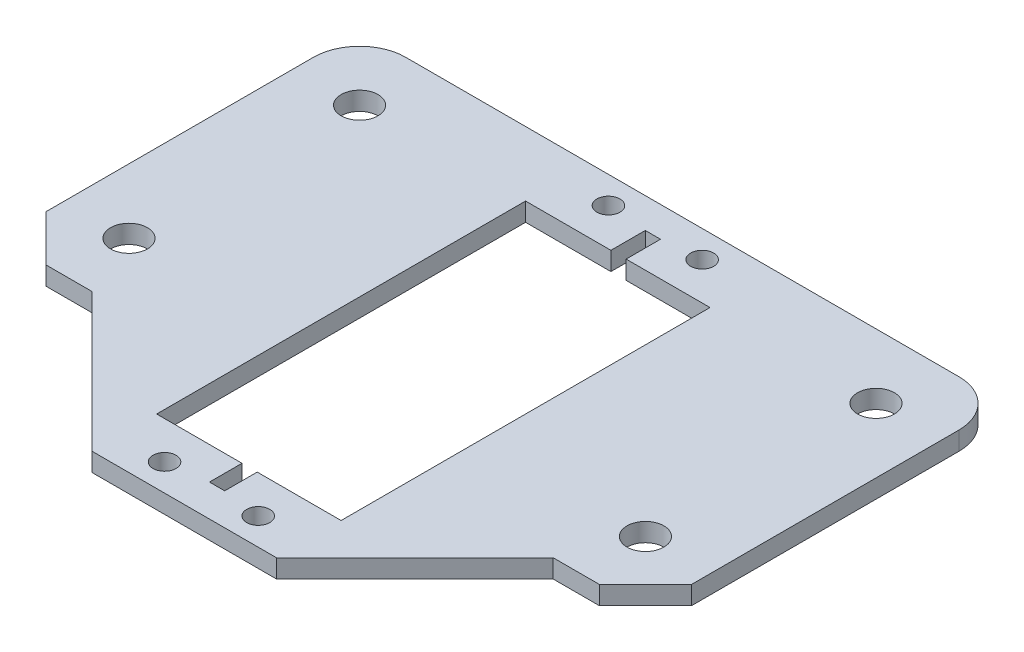
ISO-10303-21;
HEADER;
FILE_DESCRIPTION(('STEP AP214'),'2;1');
FILE_NAME('part.step','',(''),(''),'','','');
FILE_SCHEMA(('AUTOMOTIVE_DESIGN { 1 0 10303 214 1 1 1 1 }'));
ENDSEC;
DATA;
#1=APPLICATION_CONTEXT('core data for automotive mechanical design processes');
#2=APPLICATION_PROTOCOL_DEFINITION('international standard','automotive_design',2000,#1);
#3=PRODUCT_CONTEXT('',#1,'mechanical');
#4=PRODUCT('Part','Part','',(#3));
#5=PRODUCT_RELATED_PRODUCT_CATEGORY('part','',(#4));
#6=PRODUCT_DEFINITION_FORMATION('','',#4);
#7=PRODUCT_DEFINITION_CONTEXT('part definition',#1,'design');
#8=PRODUCT_DEFINITION('design','',#6,#7);
#9=PRODUCT_DEFINITION_SHAPE('','',#8);
#10=(LENGTH_UNIT() NAMED_UNIT(*) SI_UNIT(.MILLI.,.METRE.));
#11=(NAMED_UNIT(*) PLANE_ANGLE_UNIT() SI_UNIT($,.RADIAN.));
#12=(NAMED_UNIT(*) SI_UNIT($,.STERADIAN.) SOLID_ANGLE_UNIT());
#13=UNCERTAINTY_MEASURE_WITH_UNIT(LENGTH_MEASURE(1.E-05),#10,'distance_accuracy_value','');
#14=(GEOMETRIC_REPRESENTATION_CONTEXT(3) GLOBAL_UNCERTAINTY_ASSIGNED_CONTEXT((#13)) GLOBAL_UNIT_ASSIGNED_CONTEXT((#10,
#11,#12)) REPRESENTATION_CONTEXT('',''));
#15=CARTESIAN_POINT('',(0.,0.,0.));
#16=DIRECTION('',(0.,0.,1.));
#17=DIRECTION('',(1.,0.,0.));
#18=AXIS2_PLACEMENT_3D('',#15,#16,#17);
#19=CARTESIAN_POINT('',(-15.8393117352359,2.,13.3286413196333));
#20=DIRECTION('',(0.,0.,1.));
#21=DIRECTION('',(1.,0.,0.));
#22=AXIS2_PLACEMENT_3D('',#19,#20,#21);
#23=PLANE('',#22);
#24=DIRECTION('',(0.,1.,0.));
#25=VECTOR('',#24,1.);
#26=CARTESIAN_POINT('',(-4.93621326802125,2.,13.3286413196333));
#27=LINE('',#26,#25);
#28=CARTESIAN_POINT('',(-4.93621326802125,0.,13.3286413196333));
#29=VERTEX_POINT('',#28);
#30=CARTESIAN_POINT('',(-4.93621326802125,2.,13.3286413196333));
#31=VERTEX_POINT('',#30);
#32=EDGE_CURVE('E207',#29,#31,#27,.T.);
#33=ORIENTED_EDGE('',*,*,#32,.F.);
#34=DIRECTION('',(-1.,0.,0.));
#35=VECTOR('',#34,1.);
#36=CARTESIAN_POINT('',(-15.8393117352359,0.,13.3286413196333));
#37=LINE('',#36,#35);
#38=CARTESIAN_POINT('',(4.16068826476406,0.,13.3286413196333));
#39=VERTEX_POINT('',#38);
#40=EDGE_CURVE('E224',#39,#29,#37,.T.);
#41=ORIENTED_EDGE('',*,*,#40,.F.);
#42=DIRECTION('',(0.,-1.,0.));
#43=VECTOR('',#42,1.);
#44=CARTESIAN_POINT('',(4.16068826476406,2.,13.3286413196333));
#45=LINE('',#44,#43);
#46=CARTESIAN_POINT('',(4.16068826476406,2.,13.3286413196333));
#47=VERTEX_POINT('',#46);
#48=EDGE_CURVE('E234',#47,#39,#45,.T.);
#49=ORIENTED_EDGE('',*,*,#48,.F.);
#50=DIRECTION('',(-1.,0.,0.));
#51=VECTOR('',#50,1.);
#52=CARTESIAN_POINT('',(-15.8393117352359,2.,13.3286413196333));
#53=LINE('',#52,#51);
#54=EDGE_CURVE('E235',#47,#31,#53,.T.);
#55=ORIENTED_EDGE('',*,*,#54,.T.);
#56=EDGE_LOOP('',(#33,#41,#49,#55));
#57=FACE_BOUND('',#56,.T.);
#58=ADVANCED_FACE('F33',(#57),#23,.T.);
#59=CARTESIAN_POINT('',(-15.8393117352359,2.,53.3286413196333));
#60=DIRECTION('',(0.,0.,-1.));
#61=DIRECTION('',(-1.,0.,0.));
#62=AXIS2_PLACEMENT_3D('',#59,#60,#61);
#63=PLANE('',#62);
#64=DIRECTION('',(0.,1.,0.));
#65=VECTOR('',#64,1.);
#66=CARTESIAN_POINT('',(-6.58654078677002,2.,53.3286413196333));
#67=LINE('',#66,#65);
#68=CARTESIAN_POINT('',(-6.58654078677002,0.,53.3286413196333));
#69=VERTEX_POINT('',#68);
#70=CARTESIAN_POINT('',(-6.58654078677002,2.,53.3286413196333));
#71=VERTEX_POINT('',#70);
#72=EDGE_CURVE('E208',#69,#71,#67,.T.);
#73=ORIENTED_EDGE('',*,*,#72,.F.);
#74=DIRECTION('',(1.,0.,0.));
#75=VECTOR('',#74,1.);
#76=CARTESIAN_POINT('',(-15.8393117352359,0.,53.3286413196333));
#77=LINE('',#76,#75);
#78=CARTESIAN_POINT('',(-15.8393117352359,0.,53.3286413196333));
#79=VERTEX_POINT('',#78);
#80=EDGE_CURVE('E229',#79,#69,#77,.T.);
#81=ORIENTED_EDGE('',*,*,#80,.F.);
#82=DIRECTION('',(0.,-1.,0.));
#83=VECTOR('',#82,1.);
#84=CARTESIAN_POINT('',(-15.8393117352359,2.,53.3286413196333));
#85=LINE('',#84,#83);
#86=CARTESIAN_POINT('',(-15.8393117352359,2.,53.3286413196333));
#87=VERTEX_POINT('',#86);
#88=EDGE_CURVE('E240',#87,#79,#85,.T.);
#89=ORIENTED_EDGE('',*,*,#88,.F.);
#90=DIRECTION('',(1.,0.,0.));
#91=VECTOR('',#90,1.);
#92=CARTESIAN_POINT('',(-15.8393117352359,2.,53.3286413196333));
#93=LINE('',#92,#91);
#94=EDGE_CURVE('E389',#87,#71,#93,.T.);
#95=ORIENTED_EDGE('',*,*,#94,.T.);
#96=EDGE_LOOP('',(#73,#81,#89,#95));
#97=FACE_BOUND('',#96,.T.);
#98=ADVANCED_FACE('F499',(#97),#63,.T.);
#99=CARTESIAN_POINT('',(0.,2.,0.));
#100=DIRECTION('',(0.,1.,0.));
#101=DIRECTION('',(0.,0.,1.));
#102=AXIS2_PLACEMENT_3D('',#99,#100,#101);
#103=PLANE('',#102);
#104=DIRECTION('',(0.,0.,-1.));
#105=VECTOR('',#104,1.);
#106=CARTESIAN_POINT('',(-4.93621326802125,2.,0.));
#107=LINE('',#106,#105);
#108=CARTESIAN_POINT('',(-4.93621326802125,2.,9.60041775357783));
#109=VERTEX_POINT('',#108);
#110=EDGE_CURVE('E429',#31,#109,#107,.T.);
#111=ORIENTED_EDGE('',*,*,#110,.F.);
#112=ORIENTED_EDGE('',*,*,#54,.F.);
#113=DIRECTION('',(0.,0.,-1.));
#114=VECTOR('',#113,1.);
#115=CARTESIAN_POINT('',(4.16068826476406,2.,13.3286413196333));
#116=LINE('',#115,#114);
#117=CARTESIAN_POINT('',(4.16068826476407,2.,53.3286413196333));
#118=VERTEX_POINT('',#117);
#119=EDGE_CURVE('E392',#118,#47,#116,.T.);
#120=ORIENTED_EDGE('',*,*,#119,.F.);
#121=CARTESIAN_POINT('',(-4.93621326802125,2.,53.3286413196333));
#122=VERTEX_POINT('',#121);
#123=EDGE_CURVE('E388',#122,#118,#93,.T.);
#124=ORIENTED_EDGE('',*,*,#123,.F.);
#125=DIRECTION('',(0.,0.,-1.));
#126=VECTOR('',#125,1.);
#127=CARTESIAN_POINT('',(-4.93621326802125,2.,0.));
#128=LINE('',#127,#126);
#129=CARTESIAN_POINT('',(-4.93621326802125,2.,56.8558546423131));
#130=VERTEX_POINT('',#129);
#131=EDGE_CURVE('E442',#130,#122,#128,.T.);
#132=ORIENTED_EDGE('',*,*,#131,.F.);
#133=DIRECTION('',(1.,0.,0.));
#134=VECTOR('',#133,1.);
#135=CARTESIAN_POINT('',(0.,2.,56.8558546423131));
#136=LINE('',#135,#134);
#137=CARTESIAN_POINT('',(-6.58654078677002,2.,56.8558546423131));
#138=VERTEX_POINT('',#137);
#139=EDGE_CURVE('E447',#138,#130,#136,.T.);
#140=ORIENTED_EDGE('',*,*,#139,.F.);
#141=DIRECTION('',(0.,0.,1.));
#142=VECTOR('',#141,1.);
#143=CARTESIAN_POINT('',(-6.58654078677002,2.,0.));
#144=LINE('',#143,#142);
#145=EDGE_CURVE('E445',#71,#138,#144,.T.);
#146=ORIENTED_EDGE('',*,*,#145,.F.);
#147=ORIENTED_EDGE('',*,*,#94,.F.);
#148=DIRECTION('',(0.,0.,1.));
#149=VECTOR('',#148,1.);
#150=CARTESIAN_POINT('',(-15.8393117352359,2.,13.3286413196333));
#151=LINE('',#150,#149);
#152=CARTESIAN_POINT('',(-15.8393117352359,2.,13.3286413196333));
#153=VERTEX_POINT('',#152);
#154=EDGE_CURVE('E227',#153,#87,#151,.T.);
#155=ORIENTED_EDGE('',*,*,#154,.F.);
#156=CARTESIAN_POINT('',(-6.58654078677002,2.,13.3286413196333));
#157=VERTEX_POINT('',#156);
#158=EDGE_CURVE('E395',#157,#153,#53,.T.);
#159=ORIENTED_EDGE('',*,*,#158,.F.);
#160=DIRECTION('',(0.,0.,1.));
#161=VECTOR('',#160,1.);
#162=CARTESIAN_POINT('',(-6.58654078677002,2.,0.));
#163=LINE('',#162,#161);
#164=CARTESIAN_POINT('',(-6.58654078677002,2.,9.60041775357783));
#165=VERTEX_POINT('',#164);
#166=EDGE_CURVE('E203',#165,#157,#163,.T.);
#167=ORIENTED_EDGE('',*,*,#166,.F.);
#168=DIRECTION('',(-1.,0.,0.));
#169=VECTOR('',#168,1.);
#170=CARTESIAN_POINT('',(0.,2.,9.60041775357783));
#171=LINE('',#170,#169);
#172=EDGE_CURVE('E431',#109,#165,#171,.T.);
#173=ORIENTED_EDGE('',*,*,#172,.F.);
#174=EDGE_LOOP('',(#111,#112,#120,#124,#132,#140,#146,#147,#155,#159,#167,#173));
#175=FACE_BOUND('',#174,.T.);
#176=CARTESIAN_POINT('',(22.1606882647641,2.,13.3286413196333));
#177=DIRECTION('',(0.,1.,0.));
#178=DIRECTION('',(0.,0.,1.));
#179=AXIS2_PLACEMENT_3D('',#176,#177,#178);
#180=CIRCLE('',#179,2.);
#181=CARTESIAN_POINT('',(22.1606882647641,2.,15.3286413196333));
#182=VERTEX_POINT('',#181);
#183=EDGE_CURVE('E311',#182,#182,#180,.T.);
#184=ORIENTED_EDGE('',*,*,#183,.F.);
#185=EDGE_LOOP('',(#184));
#186=FACE_BOUND('',#185,.T.);
#187=CARTESIAN_POINT('',(-33.8393117352359,2.,13.3286413196333));
#188=DIRECTION('',(0.,1.,0.));
#189=DIRECTION('',(0.,0.,1.));
#190=AXIS2_PLACEMENT_3D('',#187,#188,#189);
#191=CIRCLE('',#190,2.);
#192=CARTESIAN_POINT('',(-33.8393117352359,2.,15.3286413196333));
#193=VERTEX_POINT('',#192);
#194=EDGE_CURVE('E307',#193,#193,#191,.T.);
#195=ORIENTED_EDGE('',*,*,#194,.F.);
#196=EDGE_LOOP('',(#195));
#197=FACE_BOUND('',#196,.T.);
#198=CARTESIAN_POINT('',(-33.8393117352359,2.,38.3286413196333));
#199=DIRECTION('',(0.,1.,0.));
#200=DIRECTION('',(0.,0.,1.));
#201=AXIS2_PLACEMENT_3D('',#198,#199,#200);
#202=CIRCLE('',#201,2.);
#203=CARTESIAN_POINT('',(-33.8393117352359,2.,40.3286413196333));
#204=VERTEX_POINT('',#203);
#205=EDGE_CURVE('E303',#204,#204,#202,.T.);
#206=ORIENTED_EDGE('',*,*,#205,.F.);
#207=EDGE_LOOP('',(#206));
#208=FACE_BOUND('',#207,.T.);
#209=CARTESIAN_POINT('',(22.1606882647641,2.,38.3286413196333));
#210=DIRECTION('',(0.,1.,0.));
#211=DIRECTION('',(0.,0.,1.));
#212=AXIS2_PLACEMENT_3D('',#209,#210,#211);
#213=CIRCLE('',#212,2.);
#214=CARTESIAN_POINT('',(22.1606882647641,2.,40.3286413196333));
#215=VERTEX_POINT('',#214);
#216=EDGE_CURVE('E299',#215,#215,#213,.T.);
#217=ORIENTED_EDGE('',*,*,#216,.F.);
#218=EDGE_LOOP('',(#217));
#219=FACE_BOUND('',#218,.T.);
#220=CARTESIAN_POINT('',(-0.759311735229143,2.,9.2621413196285));
#221=DIRECTION('',(0.,1.,0.));
#222=DIRECTION('',(0.,0.,1.));
#223=AXIS2_PLACEMENT_3D('',#220,#221,#222);
#224=CIRCLE('',#223,1.25);
#225=CARTESIAN_POINT('',(-0.759311735229143,2.,10.5121413196285));
#226=VERTEX_POINT('',#225);
#227=EDGE_CURVE('E362',#226,#226,#224,.T.);
#228=ORIENTED_EDGE('',*,*,#227,.F.);
#229=EDGE_LOOP('',(#228));
#230=FACE_BOUND('',#229,.T.);
#231=CARTESIAN_POINT('',(-10.9193117352291,2.,9.26214131962875));
#232=DIRECTION('',(0.,1.,0.));
#233=DIRECTION('',(0.,0.,1.));
#234=AXIS2_PLACEMENT_3D('',#231,#232,#233);
#235=CIRCLE('',#234,1.25);
#236=CARTESIAN_POINT('',(-10.9193117352291,2.,10.5121413196288));
#237=VERTEX_POINT('',#236);
#238=EDGE_CURVE('E366',#237,#237,#235,.T.);
#239=ORIENTED_EDGE('',*,*,#238,.F.);
#240=EDGE_LOOP('',(#239));
#241=FACE_BOUND('',#240,.T.);
#242=CARTESIAN_POINT('',(-0.759311735227947,2.,57.3951413196285));
#243=DIRECTION('',(0.,1.,0.));
#244=DIRECTION('',(0.,0.,1.));
#245=AXIS2_PLACEMENT_3D('',#242,#243,#244);
#246=CIRCLE('',#245,1.25);
#247=CARTESIAN_POINT('',(-0.759311735227947,2.,58.6451413196285));
#248=VERTEX_POINT('',#247);
#249=EDGE_CURVE('E372',#248,#248,#246,.T.);
#250=ORIENTED_EDGE('',*,*,#249,.F.);
#251=EDGE_LOOP('',(#250));
#252=FACE_BOUND('',#251,.T.);
#253=CARTESIAN_POINT('',(-10.919311735228,2.,57.3951413196287));
#254=DIRECTION('',(0.,1.,0.));
#255=DIRECTION('',(0.,0.,1.));
#256=AXIS2_PLACEMENT_3D('',#253,#254,#255);
#257=CIRCLE('',#256,1.25);
#258=CARTESIAN_POINT('',(-10.919311735228,2.,58.6451413196287));
#259=VERTEX_POINT('',#258);
#260=EDGE_CURVE('E378',#259,#259,#257,.T.);
#261=ORIENTED_EDGE('',*,*,#260,.F.);
#262=EDGE_LOOP('',(#261));
#263=FACE_BOUND('',#262,.T.);
#264=DIRECTION('',(-1.,0.,0.));
#265=VECTOR('',#264,1.);
#266=CARTESIAN_POINT('',(-30.8393117352359,2.,6.32864131963334));
#267=LINE('',#266,#265);
#268=CARTESIAN_POINT('',(24.1606882647641,2.,6.32864131963333));
#269=VERTEX_POINT('',#268);
#270=CARTESIAN_POINT('',(-35.8393117352359,2.,6.32864131963334));
#271=VERTEX_POINT('',#270);
#272=EDGE_CURVE('E247',#269,#271,#267,.T.);
#273=ORIENTED_EDGE('',*,*,#272,.T.);
#274=CARTESIAN_POINT('',(-35.8393117352359,2.,11.3286413196333));
#275=DIRECTION('',(0.,1.,0.));
#276=DIRECTION('',(0.,0.,1.));
#277=AXIS2_PLACEMENT_3D('',#274,#275,#276);
#278=CIRCLE('',#277,5.);
#279=CARTESIAN_POINT('',(-40.8393117352359,2.,11.3286413196333));
#280=VERTEX_POINT('',#279);
#281=EDGE_CURVE('E41',#271,#280,#278,.T.);
#282=ORIENTED_EDGE('',*,*,#281,.T.);
#283=DIRECTION('',(0.,0.,-1.));
#284=VECTOR('',#283,1.);
#285=CARTESIAN_POINT('',(-40.8393117352359,2.,6.32864131963334));
#286=LINE('',#285,#284);
#287=CARTESIAN_POINT('',(-40.8393117352359,2.,40.3286413196333));
#288=VERTEX_POINT('',#287);
#289=EDGE_CURVE('E330',#288,#280,#286,.T.);
#290=ORIENTED_EDGE('',*,*,#289,.F.);
#291=DIRECTION('',(0.70710678118655,0.,0.707106781186546));
#292=VECTOR('',#291,1.);
#293=CARTESIAN_POINT('',(-40.5839765274345,2.,40.5839765274347));
#294=LINE('',#293,#292);
#295=CARTESIAN_POINT('',(-35.8393117352359,2.,45.3286413196333));
#296=VERTEX_POINT('',#295);
#297=EDGE_CURVE('E284',#288,#296,#294,.T.);
#298=ORIENTED_EDGE('',*,*,#297,.T.);
#299=DIRECTION('',(1.,0.,0.));
#300=VECTOR('',#299,1.);
#301=CARTESIAN_POINT('',(-40.8393117352359,2.,45.3286413196333));
#302=LINE('',#301,#300);
#303=CARTESIAN_POINT('',(-30.8393117352359,2.,45.3286413196333));
#304=VERTEX_POINT('',#303);
#305=EDGE_CURVE('E337',#296,#304,#302,.T.);
#306=ORIENTED_EDGE('',*,*,#305,.T.);
#307=DIRECTION('',(-0.707106781186546,0.,-0.707106781186549));
#308=VECTOR('',#307,1.);
#309=CARTESIAN_POINT('',(-38.0839765274347,2.,38.0839765274345));
#310=LINE('',#309,#308);
#311=CARTESIAN_POINT('',(-15.8393117352359,2.,60.3286413196333));
#312=VERTEX_POINT('',#311);
#313=EDGE_CURVE('E266',#304,#312,#310,.F.);
#314=ORIENTED_EDGE('',*,*,#313,.T.);
#315=DIRECTION('',(1.,0.,0.));
#316=VECTOR('',#315,1.);
#317=CARTESIAN_POINT('',(-30.8393117352359,2.,60.3286413196333));
#318=LINE('',#317,#316);
#319=CARTESIAN_POINT('',(4.16068826476403,2.,60.3286413196333));
#320=VERTEX_POINT('',#319);
#321=EDGE_CURVE('E244',#312,#320,#318,.T.);
#322=ORIENTED_EDGE('',*,*,#321,.T.);
#323=DIRECTION('',(-0.707106781186549,0.,0.707106781186546));
#324=VECTOR('',#323,1.);
#325=CARTESIAN_POINT('',(32.2446647921987,2.,32.2446647921988));
#326=LINE('',#325,#324);
#327=CARTESIAN_POINT('',(19.1606882647641,2.,45.3286413196333));
#328=VERTEX_POINT('',#327);
#329=EDGE_CURVE('E268',#320,#328,#326,.F.);
#330=ORIENTED_EDGE('',*,*,#329,.T.);
#331=DIRECTION('',(-1.,0.,0.));
#332=VECTOR('',#331,1.);
#333=CARTESIAN_POINT('',(29.1606882647641,2.,45.3286413196333));
#334=LINE('',#333,#332);
#335=CARTESIAN_POINT('',(24.1606882647641,2.,45.3286413196333));
#336=VERTEX_POINT('',#335);
#337=EDGE_CURVE('E354',#336,#328,#334,.T.);
#338=ORIENTED_EDGE('',*,*,#337,.F.);
#339=DIRECTION('',(0.707106781186549,0.,-0.707106781186547));
#340=VECTOR('',#339,1.);
#341=CARTESIAN_POINT('',(34.7446647921987,2.,34.7446647921988));
#342=LINE('',#341,#340);
#343=CARTESIAN_POINT('',(29.1606882647641,2.,40.3286413196334));
#344=VERTEX_POINT('',#343);
#345=EDGE_CURVE('E286',#336,#344,#342,.T.);
#346=ORIENTED_EDGE('',*,*,#345,.T.);
#347=DIRECTION('',(0.,0.,1.));
#348=VECTOR('',#347,1.);
#349=CARTESIAN_POINT('',(29.1606882647641,2.,45.3286413196333));
#350=LINE('',#349,#348);
#351=CARTESIAN_POINT('',(29.1606882647641,2.,11.3286413196333));
#352=VERTEX_POINT('',#351);
#353=EDGE_CURVE('E351',#352,#344,#350,.T.);
#354=ORIENTED_EDGE('',*,*,#353,.F.);
#355=CARTESIAN_POINT('',(24.1606882647641,2.,11.3286413196333));
#356=DIRECTION('',(0.,1.,0.));
#357=DIRECTION('',(0.,0.,1.));
#358=AXIS2_PLACEMENT_3D('',#355,#356,#357);
#359=CIRCLE('',#358,5.);
#360=EDGE_CURVE('E48',#352,#269,#359,.T.);
#361=ORIENTED_EDGE('',*,*,#360,.T.);
#362=EDGE_LOOP('',(#273,#282,#290,#298,#306,#314,#322,#330,#338,#346,#354,#361));
#363=FACE_BOUND('',#362,.T.);
#364=ADVANCED_FACE('F329',(#175,#186,#197,#208,#219,#230,#241,#252,#263,#363),#103,.T.);
#365=CARTESIAN_POINT('',(0.,0.,0.));
#366=DIRECTION('',(0.,1.,0.));
#367=DIRECTION('',(0.,0.,1.));
#368=AXIS2_PLACEMENT_3D('',#365,#366,#367);
#369=PLANE('',#368);
#370=CARTESIAN_POINT('',(22.1606882647641,0.,13.3286413196333));
#371=DIRECTION('',(0.,1.,0.));
#372=DIRECTION('',(0.,0.,1.));
#373=AXIS2_PLACEMENT_3D('',#370,#371,#372);
#374=CIRCLE('',#373,2.);
#375=CARTESIAN_POINT('',(22.1606882647641,0.,15.3286413196333));
#376=VERTEX_POINT('',#375);
#377=EDGE_CURVE('E308',#376,#376,#374,.T.);
#378=ORIENTED_EDGE('',*,*,#377,.T.);
#379=EDGE_LOOP('',(#378));
#380=FACE_BOUND('',#379,.T.);
#381=CARTESIAN_POINT('',(-33.8393117352359,0.,13.3286413196333));
#382=DIRECTION('',(0.,1.,0.));
#383=DIRECTION('',(0.,0.,1.));
#384=AXIS2_PLACEMENT_3D('',#381,#382,#383);
#385=CIRCLE('',#384,2.);
#386=CARTESIAN_POINT('',(-33.8393117352359,0.,15.3286413196333));
#387=VERTEX_POINT('',#386);
#388=EDGE_CURVE('E304',#387,#387,#385,.T.);
#389=ORIENTED_EDGE('',*,*,#388,.T.);
#390=EDGE_LOOP('',(#389));
#391=FACE_BOUND('',#390,.T.);
#392=CARTESIAN_POINT('',(-33.8393117352359,0.,38.3286413196333));
#393=DIRECTION('',(0.,1.,0.));
#394=DIRECTION('',(0.,0.,1.));
#395=AXIS2_PLACEMENT_3D('',#392,#393,#394);
#396=CIRCLE('',#395,2.);
#397=CARTESIAN_POINT('',(-33.8393117352359,0.,40.3286413196333));
#398=VERTEX_POINT('',#397);
#399=EDGE_CURVE('E300',#398,#398,#396,.T.);
#400=ORIENTED_EDGE('',*,*,#399,.T.);
#401=EDGE_LOOP('',(#400));
#402=FACE_BOUND('',#401,.T.);
#403=CARTESIAN_POINT('',(22.1606882647641,0.,38.3286413196333));
#404=DIRECTION('',(0.,1.,0.));
#405=DIRECTION('',(0.,0.,1.));
#406=AXIS2_PLACEMENT_3D('',#403,#404,#405);
#407=CIRCLE('',#406,2.);
#408=CARTESIAN_POINT('',(22.1606882647641,0.,40.3286413196333));
#409=VERTEX_POINT('',#408);
#410=EDGE_CURVE('E295',#409,#409,#407,.T.);
#411=ORIENTED_EDGE('',*,*,#410,.T.);
#412=EDGE_LOOP('',(#411));
#413=FACE_BOUND('',#412,.T.);
#414=CARTESIAN_POINT('',(-0.759311735229143,0.,9.2621413196285));
#415=DIRECTION('',(0.,1.,0.));
#416=DIRECTION('',(0.,0.,1.));
#417=AXIS2_PLACEMENT_3D('',#414,#415,#416);
#418=CIRCLE('',#417,1.25);
#419=CARTESIAN_POINT('',(-0.759311735229143,0.,10.5121413196285));
#420=VERTEX_POINT('',#419);
#421=EDGE_CURVE('E363',#420,#420,#418,.T.);
#422=ORIENTED_EDGE('',*,*,#421,.T.);
#423=EDGE_LOOP('',(#422));
#424=FACE_BOUND('',#423,.T.);
#425=CARTESIAN_POINT('',(-10.9193117352291,0.,9.26214131962875));
#426=DIRECTION('',(0.,1.,0.));
#427=DIRECTION('',(0.,0.,1.));
#428=AXIS2_PLACEMENT_3D('',#425,#426,#427);
#429=CIRCLE('',#428,1.25);
#430=CARTESIAN_POINT('',(-10.9193117352291,0.,10.5121413196288));
#431=VERTEX_POINT('',#430);
#432=EDGE_CURVE('E369',#431,#431,#429,.T.);
#433=ORIENTED_EDGE('',*,*,#432,.T.);
#434=EDGE_LOOP('',(#433));
#435=FACE_BOUND('',#434,.T.);
#436=CARTESIAN_POINT('',(-0.759311735227947,0.,57.3951413196285));
#437=DIRECTION('',(0.,1.,0.));
#438=DIRECTION('',(0.,0.,1.));
#439=AXIS2_PLACEMENT_3D('',#436,#437,#438);
#440=CIRCLE('',#439,1.25);
#441=CARTESIAN_POINT('',(-0.759311735227947,0.,58.6451413196285));
#442=VERTEX_POINT('',#441);
#443=EDGE_CURVE('E375',#442,#442,#440,.T.);
#444=ORIENTED_EDGE('',*,*,#443,.T.);
#445=EDGE_LOOP('',(#444));
#446=FACE_BOUND('',#445,.T.);
#447=CARTESIAN_POINT('',(-10.919311735228,0.,57.3951413196287));
#448=DIRECTION('',(0.,1.,0.));
#449=DIRECTION('',(0.,0.,1.));
#450=AXIS2_PLACEMENT_3D('',#447,#448,#449);
#451=CIRCLE('',#450,1.25);
#452=CARTESIAN_POINT('',(-10.919311735228,0.,58.6451413196287));
#453=VERTEX_POINT('',#452);
#454=EDGE_CURVE('E381',#453,#453,#451,.T.);
#455=ORIENTED_EDGE('',*,*,#454,.T.);
#456=EDGE_LOOP('',(#455));
#457=FACE_BOUND('',#456,.T.);
#458=DIRECTION('',(0.,0.,1.));
#459=VECTOR('',#458,1.);
#460=CARTESIAN_POINT('',(-40.8393117352359,0.,6.32864131963334));
#461=LINE('',#460,#459);
#462=CARTESIAN_POINT('',(-40.8393117352359,0.,11.3286413196333));
#463=VERTEX_POINT('',#462);
#464=CARTESIAN_POINT('',(-40.8393117352359,0.,40.3286413196333));
#465=VERTEX_POINT('',#464);
#466=EDGE_CURVE('E298',#463,#465,#461,.T.);
#467=ORIENTED_EDGE('',*,*,#466,.F.);
#468=CARTESIAN_POINT('',(-35.8393117352359,0.,11.3286413196333));
#469=DIRECTION('',(0.,1.,0.));
#470=DIRECTION('',(0.,0.,1.));
#471=AXIS2_PLACEMENT_3D('',#468,#469,#470);
#472=CIRCLE('',#471,5.);
#473=CARTESIAN_POINT('',(-35.8393117352359,0.,6.32864131963334));
#474=VERTEX_POINT('',#473);
#475=EDGE_CURVE('E320',#463,#474,#472,.F.);
#476=ORIENTED_EDGE('',*,*,#475,.T.);
#477=DIRECTION('',(-1.,0.,0.));
#478=VECTOR('',#477,1.);
#479=CARTESIAN_POINT('',(-30.8393117352359,0.,6.32864131963334));
#480=LINE('',#479,#478);
#481=CARTESIAN_POINT('',(24.1606882647641,0.,6.32864131963333));
#482=VERTEX_POINT('',#481);
#483=EDGE_CURVE('E248',#482,#474,#480,.T.);
#484=ORIENTED_EDGE('',*,*,#483,.F.);
#485=CARTESIAN_POINT('',(24.1606882647641,0.,11.3286413196333));
#486=DIRECTION('',(0.,1.,0.));
#487=DIRECTION('',(0.,0.,1.));
#488=AXIS2_PLACEMENT_3D('',#485,#486,#487);
#489=CIRCLE('',#488,5.);
#490=CARTESIAN_POINT('',(29.1606882647641,0.,11.3286413196333));
#491=VERTEX_POINT('',#490);
#492=EDGE_CURVE('E318',#482,#491,#489,.F.);
#493=ORIENTED_EDGE('',*,*,#492,.T.);
#494=DIRECTION('',(0.,0.,-1.));
#495=VECTOR('',#494,1.);
#496=CARTESIAN_POINT('',(29.1606882647641,0.,45.3286413196333));
#497=LINE('',#496,#495);
#498=CARTESIAN_POINT('',(29.1606882647641,0.,40.3286413196333));
#499=VERTEX_POINT('',#498);
#500=EDGE_CURVE('E346',#499,#491,#497,.T.);
#501=ORIENTED_EDGE('',*,*,#500,.F.);
#502=DIRECTION('',(-0.707106781186549,0.,0.707106781186547));
#503=VECTOR('',#502,1.);
#504=CARTESIAN_POINT('',(29.1606882647641,0.,40.3286413196333));
#505=LINE('',#504,#503);
#506=CARTESIAN_POINT('',(24.1606882647641,0.,45.3286413196333));
#507=VERTEX_POINT('',#506);
#508=EDGE_CURVE('E280',#499,#507,#505,.T.);
#509=ORIENTED_EDGE('',*,*,#508,.T.);
#510=DIRECTION('',(-1.,0.,0.));
#511=VECTOR('',#510,1.);
#512=CARTESIAN_POINT('',(29.1606882647641,0.,45.3286413196333));
#513=LINE('',#512,#511);
#514=CARTESIAN_POINT('',(19.1606882647641,0.,45.3286413196333));
#515=VERTEX_POINT('',#514);
#516=EDGE_CURVE('E360',#507,#515,#513,.T.);
#517=ORIENTED_EDGE('',*,*,#516,.T.);
#518=DIRECTION('',(0.707106781186549,0.,-0.707106781186546));
#519=VECTOR('',#518,1.);
#520=CARTESIAN_POINT('',(19.1606882647641,0.,45.3286413196333));
#521=LINE('',#520,#519);
#522=CARTESIAN_POINT('',(4.16068826476403,0.,60.3286413196333));
#523=VERTEX_POINT('',#522);
#524=EDGE_CURVE('E259',#515,#523,#521,.F.);
#525=ORIENTED_EDGE('',*,*,#524,.T.);
#526=DIRECTION('',(1.,0.,0.));
#527=VECTOR('',#526,1.);
#528=CARTESIAN_POINT('',(-30.8393117352359,0.,60.3286413196333));
#529=LINE('',#528,#527);
#530=CARTESIAN_POINT('',(-15.8393117352359,0.,60.3286413196333));
#531=VERTEX_POINT('',#530);
#532=EDGE_CURVE('E243',#531,#523,#529,.T.);
#533=ORIENTED_EDGE('',*,*,#532,.F.);
#534=DIRECTION('',(0.707106781186546,0.,0.707106781186549));
#535=VECTOR('',#534,1.);
#536=CARTESIAN_POINT('',(-15.8393117352359,0.,60.3286413196333));
#537=LINE('',#536,#535);
#538=CARTESIAN_POINT('',(-30.8393117352359,0.,45.3286413196333));
#539=VERTEX_POINT('',#538);
#540=EDGE_CURVE('E256',#531,#539,#537,.F.);
#541=ORIENTED_EDGE('',*,*,#540,.T.);
#542=DIRECTION('',(1.,0.,0.));
#543=VECTOR('',#542,1.);
#544=CARTESIAN_POINT('',(-40.8393117352359,0.,45.3286413196333));
#545=LINE('',#544,#543);
#546=CARTESIAN_POINT('',(-35.8393117352359,0.,45.3286413196333));
#547=VERTEX_POINT('',#546);
#548=EDGE_CURVE('E352',#547,#539,#545,.T.);
#549=ORIENTED_EDGE('',*,*,#548,.F.);
#550=DIRECTION('',(-0.70710678118655,0.,-0.707106781186546));
#551=VECTOR('',#550,1.);
#552=CARTESIAN_POINT('',(-40.8393117352359,0.,40.3286413196333));
#553=LINE('',#552,#551);
#554=EDGE_CURVE('E277',#547,#465,#553,.T.);
#555=ORIENTED_EDGE('',*,*,#554,.T.);
#556=EDGE_LOOP('',(#467,#476,#484,#493,#501,#509,#517,#525,#533,#541,#549,#555));
#557=FACE_BOUND('',#556,.T.);
#558=ORIENTED_EDGE('',*,*,#40,.T.);
#559=DIRECTION('',(0.,0.,1.));
#560=VECTOR('',#559,1.);
#561=CARTESIAN_POINT('',(-4.93621326802125,0.,13.3286413196333));
#562=LINE('',#561,#560);
#563=CARTESIAN_POINT('',(-4.93621326802125,0.,9.60041775357783));
#564=VERTEX_POINT('',#563);
#565=EDGE_CURVE('E419',#564,#29,#562,.T.);
#566=ORIENTED_EDGE('',*,*,#565,.F.);
#567=DIRECTION('',(1.,0.,0.));
#568=VECTOR('',#567,1.);
#569=CARTESIAN_POINT('',(-4.93621326802125,0.,9.60041775357783));
#570=LINE('',#569,#568);
#571=CARTESIAN_POINT('',(-6.58654078677002,0.,9.60041775357783));
#572=VERTEX_POINT('',#571);
#573=EDGE_CURVE('E218',#572,#564,#570,.T.);
#574=ORIENTED_EDGE('',*,*,#573,.F.);
#575=DIRECTION('',(0.,0.,-1.));
#576=VECTOR('',#575,1.);
#577=CARTESIAN_POINT('',(-6.58654078677002,0.,9.60041775357783));
#578=LINE('',#577,#576);
#579=CARTESIAN_POINT('',(-6.58654078677002,0.,13.3286413196333));
#580=VERTEX_POINT('',#579);
#581=EDGE_CURVE('E200',#580,#572,#578,.T.);
#582=ORIENTED_EDGE('',*,*,#581,.F.);
#583=CARTESIAN_POINT('',(-15.8393117352359,0.,13.3286413196333));
#584=VERTEX_POINT('',#583);
#585=EDGE_CURVE('E214',#580,#584,#37,.T.);
#586=ORIENTED_EDGE('',*,*,#585,.T.);
#587=DIRECTION('',(0.,0.,1.));
#588=VECTOR('',#587,1.);
#589=CARTESIAN_POINT('',(-15.8393117352359,0.,13.3286413196333));
#590=LINE('',#589,#588);
#591=EDGE_CURVE('E384',#584,#79,#590,.T.);
#592=ORIENTED_EDGE('',*,*,#591,.T.);
#593=ORIENTED_EDGE('',*,*,#80,.T.);
#594=DIRECTION('',(0.,0.,-1.));
#595=VECTOR('',#594,1.);
#596=CARTESIAN_POINT('',(-6.58654078677002,0.,53.3286413196333));
#597=LINE('',#596,#595);
#598=CARTESIAN_POINT('',(-6.58654078677002,0.,56.8558546423131));
#599=VERTEX_POINT('',#598);
#600=EDGE_CURVE('E437',#599,#69,#597,.T.);
#601=ORIENTED_EDGE('',*,*,#600,.F.);
#602=DIRECTION('',(-1.,0.,0.));
#603=VECTOR('',#602,1.);
#604=CARTESIAN_POINT('',(-6.58654078677002,0.,56.8558546423131));
#605=LINE('',#604,#603);
#606=CARTESIAN_POINT('',(-4.93621326802125,0.,56.8558546423131));
#607=VERTEX_POINT('',#606);
#608=EDGE_CURVE('E434',#607,#599,#605,.T.);
#609=ORIENTED_EDGE('',*,*,#608,.F.);
#610=DIRECTION('',(0.,0.,1.));
#611=VECTOR('',#610,1.);
#612=CARTESIAN_POINT('',(-4.93621326802125,0.,56.8558546423131));
#613=LINE('',#612,#611);
#614=CARTESIAN_POINT('',(-4.93621326802125,0.,53.3286413196333));
#615=VERTEX_POINT('',#614);
#616=EDGE_CURVE('E406',#615,#607,#613,.T.);
#617=ORIENTED_EDGE('',*,*,#616,.F.);
#618=CARTESIAN_POINT('',(4.16068826476407,0.,53.3286413196333));
#619=VERTEX_POINT('',#618);
#620=EDGE_CURVE('E398',#615,#619,#77,.T.);
#621=ORIENTED_EDGE('',*,*,#620,.T.);
#622=DIRECTION('',(0.,0.,-1.));
#623=VECTOR('',#622,1.);
#624=CARTESIAN_POINT('',(4.16068826476406,0.,13.3286413196333));
#625=LINE('',#624,#623);
#626=EDGE_CURVE('E225',#619,#39,#625,.T.);
#627=ORIENTED_EDGE('',*,*,#626,.T.);
#628=EDGE_LOOP('',(#558,#566,#574,#582,#586,#592,#593,#601,#609,#617,#621,#627));
#629=FACE_BOUND('',#628,.T.);
#630=ADVANCED_FACE('F212',(#380,#391,#402,#413,#424,#435,#446,#457,#557,#629),#369,.F.);
#631=CARTESIAN_POINT('',(-30.8393117352359,2.,60.3286413196333));
#632=DIRECTION('',(0.,0.,-1.));
#633=DIRECTION('',(-1.,0.,0.));
#634=AXIS2_PLACEMENT_3D('',#631,#632,#633);
#635=PLANE('',#634);
#636=ORIENTED_EDGE('',*,*,#532,.T.);
#637=DIRECTION('',(0.,1.,0.));
#638=VECTOR('',#637,1.);
#639=CARTESIAN_POINT('',(4.16068826476403,2.,60.3286413196333));
#640=LINE('',#639,#638);
#641=EDGE_CURVE('E264',#523,#320,#640,.T.);
#642=ORIENTED_EDGE('',*,*,#641,.T.);
#643=ORIENTED_EDGE('',*,*,#321,.F.);
#644=DIRECTION('',(0.,-1.,0.));
#645=VECTOR('',#644,1.);
#646=CARTESIAN_POINT('',(-15.8393117352359,2.,60.3286413196333));
#647=LINE('',#646,#645);
#648=EDGE_CURVE('E261',#312,#531,#647,.T.);
#649=ORIENTED_EDGE('',*,*,#648,.T.);
#650=EDGE_LOOP('',(#636,#642,#643,#649));
#651=FACE_BOUND('',#650,.T.);
#652=ADVANCED_FACE('F471',(#651),#635,.F.);
#653=CARTESIAN_POINT('',(-30.8393117352359,2.,6.32864131963334));
#654=DIRECTION('',(0.,0.,1.));
#655=DIRECTION('',(1.,0.,0.));
#656=AXIS2_PLACEMENT_3D('',#653,#654,#655);
#657=PLANE('',#656);
#658=ORIENTED_EDGE('',*,*,#483,.T.);
#659=DIRECTION('',(0.,-1.,0.));
#660=VECTOR('',#659,1.);
#661=CARTESIAN_POINT('',(-35.8393117352359,2.,6.32864131963334));
#662=LINE('',#661,#660);
#663=EDGE_CURVE('E55',#474,#271,#662,.F.);
#664=ORIENTED_EDGE('',*,*,#663,.T.);
#665=ORIENTED_EDGE('',*,*,#272,.F.);
#666=DIRECTION('',(0.,1.,0.));
#667=VECTOR('',#666,1.);
#668=CARTESIAN_POINT('',(24.1606882647641,0.,6.32864131963333));
#669=LINE('',#668,#667);
#670=EDGE_CURVE('E322',#269,#482,#669,.F.);
#671=ORIENTED_EDGE('',*,*,#670,.T.);
#672=EDGE_LOOP('',(#658,#664,#665,#671));
#673=FACE_BOUND('',#672,.T.);
#674=ADVANCED_FACE('F343',(#673),#657,.F.);
#675=CARTESIAN_POINT('',(-15.8393117352359,2.,13.3286413196333));
#676=DIRECTION('',(1.,0.,0.));
#677=DIRECTION('',(0.,0.,-1.));
#678=AXIS2_PLACEMENT_3D('',#675,#676,#677);
#679=PLANE('',#678);
#680=ORIENTED_EDGE('',*,*,#591,.F.);
#681=DIRECTION('',(0.,-1.,0.));
#682=VECTOR('',#681,1.);
#683=CARTESIAN_POINT('',(-15.8393117352359,2.,13.3286413196333));
#684=LINE('',#683,#682);
#685=EDGE_CURVE('E223',#153,#584,#684,.T.);
#686=ORIENTED_EDGE('',*,*,#685,.F.);
#687=ORIENTED_EDGE('',*,*,#154,.T.);
#688=ORIENTED_EDGE('',*,*,#88,.T.);
#689=EDGE_LOOP('',(#680,#686,#687,#688));
#690=FACE_BOUND('',#689,.T.);
#691=ADVANCED_FACE('F519',(#690),#679,.T.);
#692=DIRECTION('',(0.,-1.,0.));
#693=VECTOR('',#692,1.);
#694=CARTESIAN_POINT('',(-4.93621326802125,2.,53.3286413196333));
#695=LINE('',#694,#693);
#696=EDGE_CURVE('E294',#122,#615,#695,.T.);
#697=ORIENTED_EDGE('',*,*,#696,.F.);
#698=ORIENTED_EDGE('',*,*,#123,.T.);
#699=DIRECTION('',(0.,-1.,0.));
#700=VECTOR('',#699,1.);
#701=CARTESIAN_POINT('',(4.16068826476407,2.,53.3286413196333));
#702=LINE('',#701,#700);
#703=EDGE_CURVE('E237',#118,#619,#702,.T.);
#704=ORIENTED_EDGE('',*,*,#703,.T.);
#705=ORIENTED_EDGE('',*,*,#620,.F.);
#706=EDGE_LOOP('',(#697,#698,#704,#705));
#707=FACE_BOUND('',#706,.T.);
#708=ADVANCED_FACE('F410',(#707),#63,.T.);
#709=CARTESIAN_POINT('',(4.16068826476406,2.,13.3286413196333));
#710=DIRECTION('',(-1.,0.,0.));
#711=DIRECTION('',(0.,0.,1.));
#712=AXIS2_PLACEMENT_3D('',#709,#710,#711);
#713=PLANE('',#712);
#714=ORIENTED_EDGE('',*,*,#626,.F.);
#715=ORIENTED_EDGE('',*,*,#703,.F.);
#716=ORIENTED_EDGE('',*,*,#119,.T.);
#717=ORIENTED_EDGE('',*,*,#48,.T.);
#718=EDGE_LOOP('',(#714,#715,#716,#717));
#719=FACE_BOUND('',#718,.T.);
#720=ADVANCED_FACE('F414',(#719),#713,.T.);
#721=DIRECTION('',(0.,-1.,0.));
#722=VECTOR('',#721,1.);
#723=CARTESIAN_POINT('',(-6.58654078677002,2.,13.3286413196333));
#724=LINE('',#723,#722);
#725=EDGE_CURVE('E196',#157,#580,#724,.T.);
#726=ORIENTED_EDGE('',*,*,#725,.F.);
#727=ORIENTED_EDGE('',*,*,#158,.T.);
#728=ORIENTED_EDGE('',*,*,#685,.T.);
#729=ORIENTED_EDGE('',*,*,#585,.F.);
#730=EDGE_LOOP('',(#726,#727,#728,#729));
#731=FACE_BOUND('',#730,.T.);
#732=ADVANCED_FACE('F221',(#731),#23,.T.);
#733=CARTESIAN_POINT('',(-10.919311735228,0.,57.3951413196287));
#734=DIRECTION('',(0.,1.,0.));
#735=DIRECTION('',(0.,0.,1.));
#736=AXIS2_PLACEMENT_3D('',#733,#734,#735);
#737=CYLINDRICAL_SURFACE('',#736,1.25);
#738=ORIENTED_EDGE('',*,*,#454,.F.);
#739=EDGE_LOOP('',(#738));
#740=FACE_BOUND('',#739,.T.);
#741=ORIENTED_EDGE('',*,*,#260,.T.);
#742=EDGE_LOOP('',(#741));
#743=FACE_BOUND('',#742,.T.);
#744=ADVANCED_FACE('F509',(#740,#743),#737,.F.);
#745=CARTESIAN_POINT('',(-0.759311735227947,0.,57.3951413196285));
#746=DIRECTION('',(0.,1.,0.));
#747=DIRECTION('',(0.,0.,1.));
#748=AXIS2_PLACEMENT_3D('',#745,#746,#747);
#749=CYLINDRICAL_SURFACE('',#748,1.25);
#750=ORIENTED_EDGE('',*,*,#443,.F.);
#751=EDGE_LOOP('',(#750));
#752=FACE_BOUND('',#751,.T.);
#753=ORIENTED_EDGE('',*,*,#249,.T.);
#754=EDGE_LOOP('',(#753));
#755=FACE_BOUND('',#754,.T.);
#756=ADVANCED_FACE('F514',(#752,#755),#749,.F.);
#757=CARTESIAN_POINT('',(-10.9193117352291,0.,9.26214131962875));
#758=DIRECTION('',(0.,1.,0.));
#759=DIRECTION('',(0.,0.,1.));
#760=AXIS2_PLACEMENT_3D('',#757,#758,#759);
#761=CYLINDRICAL_SURFACE('',#760,1.25);
#762=ORIENTED_EDGE('',*,*,#432,.F.);
#763=EDGE_LOOP('',(#762));
#764=FACE_BOUND('',#763,.T.);
#765=ORIENTED_EDGE('',*,*,#238,.T.);
#766=EDGE_LOOP('',(#765));
#767=FACE_BOUND('',#766,.T.);
#768=ADVANCED_FACE('F549',(#764,#767),#761,.F.);
#769=CARTESIAN_POINT('',(-0.759311735229143,0.,9.2621413196285));
#770=DIRECTION('',(0.,1.,0.));
#771=DIRECTION('',(0.,0.,1.));
#772=AXIS2_PLACEMENT_3D('',#769,#770,#771);
#773=CYLINDRICAL_SURFACE('',#772,1.25);
#774=ORIENTED_EDGE('',*,*,#421,.F.);
#775=EDGE_LOOP('',(#774));
#776=FACE_BOUND('',#775,.T.);
#777=ORIENTED_EDGE('',*,*,#227,.T.);
#778=EDGE_LOOP('',(#777));
#779=FACE_BOUND('',#778,.T.);
#780=ADVANCED_FACE('F535',(#776,#779),#773,.F.);
#781=CARTESIAN_POINT('',(19.1606882647641,2.,45.3286413196333));
#782=DIRECTION('',(-0.707106781186546,0.,-0.707106781186549));
#783=DIRECTION('',(0.,-1.,0.));
#784=AXIS2_PLACEMENT_3D('',#781,#782,#783);
#785=PLANE('',#784);
#786=ORIENTED_EDGE('',*,*,#329,.F.);
#787=ORIENTED_EDGE('',*,*,#641,.F.);
#788=ORIENTED_EDGE('',*,*,#524,.F.);
#789=DIRECTION('',(0.,-1.,0.));
#790=VECTOR('',#789,1.);
#791=CARTESIAN_POINT('',(19.1606882647641,2.,45.3286413196333));
#792=LINE('',#791,#790);
#793=EDGE_CURVE('E250',#328,#515,#792,.T.);
#794=ORIENTED_EDGE('',*,*,#793,.F.);
#795=EDGE_LOOP('',(#786,#787,#788,#794));
#796=FACE_BOUND('',#795,.T.);
#797=ADVANCED_FACE('F477',(#796),#785,.F.);
#798=CARTESIAN_POINT('',(-15.8393117352359,2.,60.3286413196333));
#799=DIRECTION('',(0.707106781186549,0.,-0.707106781186546));
#800=DIRECTION('',(0.,-1.,0.));
#801=AXIS2_PLACEMENT_3D('',#798,#799,#800);
#802=PLANE('',#801);
#803=ORIENTED_EDGE('',*,*,#313,.F.);
#804=DIRECTION('',(0.,1.,0.));
#805=VECTOR('',#804,1.);
#806=CARTESIAN_POINT('',(-30.8393117352359,2.,45.3286413196333));
#807=LINE('',#806,#805);
#808=EDGE_CURVE('E271',#539,#304,#807,.T.);
#809=ORIENTED_EDGE('',*,*,#808,.F.);
#810=ORIENTED_EDGE('',*,*,#540,.F.);
#811=ORIENTED_EDGE('',*,*,#648,.F.);
#812=EDGE_LOOP('',(#803,#809,#810,#811));
#813=FACE_BOUND('',#812,.T.);
#814=ADVANCED_FACE('F465',(#813),#802,.F.);
#815=CARTESIAN_POINT('',(29.1606882647641,2.,45.3286413196333));
#816=DIRECTION('',(0.,0.,-1.));
#817=DIRECTION('',(-1.,0.,0.));
#818=AXIS2_PLACEMENT_3D('',#815,#816,#817);
#819=PLANE('',#818);
#820=ORIENTED_EDGE('',*,*,#516,.F.);
#821=DIRECTION('',(0.,1.,0.));
#822=VECTOR('',#821,1.);
#823=CARTESIAN_POINT('',(24.1606882647641,2.,45.3286413196333));
#824=LINE('',#823,#822);
#825=EDGE_CURVE('E282',#507,#336,#824,.T.);
#826=ORIENTED_EDGE('',*,*,#825,.T.);
#827=ORIENTED_EDGE('',*,*,#337,.T.);
#828=ORIENTED_EDGE('',*,*,#793,.T.);
#829=EDGE_LOOP('',(#820,#826,#827,#828));
#830=FACE_BOUND('',#829,.T.);
#831=ADVANCED_FACE('F481',(#830),#819,.F.);
#832=CARTESIAN_POINT('',(29.1606882647641,0.,0.));
#833=DIRECTION('',(1.,0.,0.));
#834=DIRECTION('',(0.,0.,-1.));
#835=AXIS2_PLACEMENT_3D('',#832,#833,#834);
#836=PLANE('',#835);
#837=ORIENTED_EDGE('',*,*,#500,.T.);
#838=DIRECTION('',(0.,1.,0.));
#839=VECTOR('',#838,1.);
#840=CARTESIAN_POINT('',(29.1606882647641,2.,11.3286413196333));
#841=LINE('',#840,#839);
#842=EDGE_CURVE('E11',#491,#352,#841,.T.);
#843=ORIENTED_EDGE('',*,*,#842,.T.);
#844=ORIENTED_EDGE('',*,*,#353,.T.);
#845=DIRECTION('',(0.,-1.,0.));
#846=VECTOR('',#845,1.);
#847=CARTESIAN_POINT('',(29.1606882647641,0.,40.3286413196333));
#848=LINE('',#847,#846);
#849=EDGE_CURVE('E274',#344,#499,#848,.T.);
#850=ORIENTED_EDGE('',*,*,#849,.T.);
#851=EDGE_LOOP('',(#837,#843,#844,#850));
#852=FACE_BOUND('',#851,.T.);
#853=ADVANCED_FACE('F348',(#852),#836,.T.);
#854=CARTESIAN_POINT('',(-40.8393117352359,2.,45.3286413196333));
#855=DIRECTION('',(0.,0.,-1.));
#856=DIRECTION('',(-1.,0.,0.));
#857=AXIS2_PLACEMENT_3D('',#854,#855,#856);
#858=PLANE('',#857);
#859=ORIENTED_EDGE('',*,*,#305,.F.);
#860=DIRECTION('',(0.,-1.,0.));
#861=VECTOR('',#860,1.);
#862=CARTESIAN_POINT('',(-35.8393117352359,0.,45.3286413196333));
#863=LINE('',#862,#861);
#864=EDGE_CURVE('E292',#296,#547,#863,.T.);
#865=ORIENTED_EDGE('',*,*,#864,.T.);
#866=ORIENTED_EDGE('',*,*,#548,.T.);
#867=ORIENTED_EDGE('',*,*,#808,.T.);
#868=EDGE_LOOP('',(#859,#865,#866,#867));
#869=FACE_BOUND('',#868,.T.);
#870=ADVANCED_FACE('F466',(#869),#858,.F.);
#871=CARTESIAN_POINT('',(-40.8393117352359,0.,0.));
#872=DIRECTION('',(-1.,0.,0.));
#873=DIRECTION('',(0.,0.,1.));
#874=AXIS2_PLACEMENT_3D('',#871,#872,#873);
#875=PLANE('',#874);
#876=ORIENTED_EDGE('',*,*,#289,.T.);
#877=DIRECTION('',(0.,-1.,0.));
#878=VECTOR('',#877,1.);
#879=CARTESIAN_POINT('',(-40.8393117352359,0.,11.3286413196333));
#880=LINE('',#879,#878);
#881=EDGE_CURVE('E315',#280,#463,#880,.T.);
#882=ORIENTED_EDGE('',*,*,#881,.T.);
#883=ORIENTED_EDGE('',*,*,#466,.T.);
#884=DIRECTION('',(0.,1.,0.));
#885=VECTOR('',#884,1.);
#886=CARTESIAN_POINT('',(-40.8393117352359,2.,40.3286413196333));
#887=LINE('',#886,#885);
#888=EDGE_CURVE('E289',#465,#288,#887,.T.);
#889=ORIENTED_EDGE('',*,*,#888,.T.);
#890=EDGE_LOOP('',(#876,#882,#883,#889));
#891=FACE_BOUND('',#890,.T.);
#892=ADVANCED_FACE('F334',(#891),#875,.T.);
#893=CARTESIAN_POINT('',(29.1606882647641,0.,40.3286413196333));
#894=DIRECTION('',(0.707106781186546,0.,0.707106781186548));
#895=DIRECTION('',(0.,1.,0.));
#896=AXIS2_PLACEMENT_3D('',#893,#894,#895);
#897=PLANE('',#896);
#898=ORIENTED_EDGE('',*,*,#345,.F.);
#899=ORIENTED_EDGE('',*,*,#825,.F.);
#900=ORIENTED_EDGE('',*,*,#508,.F.);
#901=ORIENTED_EDGE('',*,*,#849,.F.);
#902=EDGE_LOOP('',(#898,#899,#900,#901));
#903=FACE_BOUND('',#902,.T.);
#904=ADVANCED_FACE('F485',(#903),#897,.T.);
#905=CARTESIAN_POINT('',(-40.8393117352359,0.,40.3286413196333));
#906=DIRECTION('',(-0.707106781186545,0.,0.707106781186549));
#907=DIRECTION('',(0.,-1.,0.));
#908=AXIS2_PLACEMENT_3D('',#905,#906,#907);
#909=PLANE('',#908);
#910=ORIENTED_EDGE('',*,*,#554,.F.);
#911=ORIENTED_EDGE('',*,*,#864,.F.);
#912=ORIENTED_EDGE('',*,*,#297,.F.);
#913=ORIENTED_EDGE('',*,*,#888,.F.);
#914=EDGE_LOOP('',(#910,#911,#912,#913));
#915=FACE_BOUND('',#914,.T.);
#916=ADVANCED_FACE('F487',(#915),#909,.T.);
#917=CARTESIAN_POINT('',(22.1606882647641,-8.,38.3286413196333));
#918=DIRECTION('',(0.,1.,0.));
#919=DIRECTION('',(0.,0.,1.));
#920=AXIS2_PLACEMENT_3D('',#917,#918,#919);
#921=CYLINDRICAL_SURFACE('',#920,2.);
#922=ORIENTED_EDGE('',*,*,#216,.T.);
#923=EDGE_LOOP('',(#922));
#924=FACE_BOUND('',#923,.T.);
#925=ORIENTED_EDGE('',*,*,#410,.F.);
#926=EDGE_LOOP('',(#925));
#927=FACE_BOUND('',#926,.T.);
#928=ADVANCED_FACE('F493',(#924,#927),#921,.F.);
#929=CARTESIAN_POINT('',(-33.8393117352359,-8.,38.3286413196333));
#930=DIRECTION('',(0.,1.,0.));
#931=DIRECTION('',(0.,0.,1.));
#932=AXIS2_PLACEMENT_3D('',#929,#930,#931);
#933=CYLINDRICAL_SURFACE('',#932,2.);
#934=ORIENTED_EDGE('',*,*,#205,.T.);
#935=EDGE_LOOP('',(#934));
#936=FACE_BOUND('',#935,.T.);
#937=ORIENTED_EDGE('',*,*,#399,.F.);
#938=EDGE_LOOP('',(#937));
#939=FACE_BOUND('',#938,.T.);
#940=ADVANCED_FACE('F624',(#936,#939),#933,.F.);
#941=CARTESIAN_POINT('',(-33.8393117352359,-8.,13.3286413196333));
#942=DIRECTION('',(0.,1.,0.));
#943=DIRECTION('',(0.,0.,1.));
#944=AXIS2_PLACEMENT_3D('',#941,#942,#943);
#945=CYLINDRICAL_SURFACE('',#944,2.);
#946=ORIENTED_EDGE('',*,*,#194,.T.);
#947=EDGE_LOOP('',(#946));
#948=FACE_BOUND('',#947,.T.);
#949=ORIENTED_EDGE('',*,*,#388,.F.);
#950=EDGE_LOOP('',(#949));
#951=FACE_BOUND('',#950,.T.);
#952=ADVANCED_FACE('F634',(#948,#951),#945,.F.);
#953=CARTESIAN_POINT('',(22.1606882647641,-8.,13.3286413196333));
#954=DIRECTION('',(0.,1.,0.));
#955=DIRECTION('',(0.,0.,1.));
#956=AXIS2_PLACEMENT_3D('',#953,#954,#955);
#957=CYLINDRICAL_SURFACE('',#956,2.);
#958=ORIENTED_EDGE('',*,*,#183,.T.);
#959=EDGE_LOOP('',(#958));
#960=FACE_BOUND('',#959,.T.);
#961=ORIENTED_EDGE('',*,*,#377,.F.);
#962=EDGE_LOOP('',(#961));
#963=FACE_BOUND('',#962,.T.);
#964=ADVANCED_FACE('F644',(#960,#963),#957,.F.);
#965=CARTESIAN_POINT('',(-6.58654078677002,10.,53.3286413196333));
#966=DIRECTION('',(-1.,0.,0.));
#967=DIRECTION('',(0.,0.,1.));
#968=AXIS2_PLACEMENT_3D('',#965,#966,#967);
#969=PLANE('',#968);
#970=ORIENTED_EDGE('',*,*,#145,.T.);
#971=DIRECTION('',(0.,-1.,0.));
#972=VECTOR('',#971,1.);
#973=CARTESIAN_POINT('',(-6.58654078677002,10.,56.8558546423131));
#974=LINE('',#973,#972);
#975=EDGE_CURVE('E440',#138,#599,#974,.T.);
#976=ORIENTED_EDGE('',*,*,#975,.T.);
#977=ORIENTED_EDGE('',*,*,#600,.T.);
#978=ORIENTED_EDGE('',*,*,#72,.T.);
#979=EDGE_LOOP('',(#970,#976,#977,#978));
#980=FACE_BOUND('',#979,.T.);
#981=ADVANCED_FACE('F653',(#980),#969,.F.);
#982=CARTESIAN_POINT('',(-6.58654078677002,10.,56.8558546423131));
#983=DIRECTION('',(0.,0.,1.));
#984=DIRECTION('',(1.,0.,0.));
#985=AXIS2_PLACEMENT_3D('',#982,#983,#984);
#986=PLANE('',#985);
#987=ORIENTED_EDGE('',*,*,#139,.T.);
#988=DIRECTION('',(0.,-1.,0.));
#989=VECTOR('',#988,1.);
#990=CARTESIAN_POINT('',(-4.93621326802125,10.,56.8558546423131));
#991=LINE('',#990,#989);
#992=EDGE_CURVE('E439',#130,#607,#991,.T.);
#993=ORIENTED_EDGE('',*,*,#992,.T.);
#994=ORIENTED_EDGE('',*,*,#608,.T.);
#995=ORIENTED_EDGE('',*,*,#975,.F.);
#996=EDGE_LOOP('',(#987,#993,#994,#995));
#997=FACE_BOUND('',#996,.T.);
#998=ADVANCED_FACE('F687',(#997),#986,.F.);
#999=CARTESIAN_POINT('',(-4.93621326802125,10.,56.8558546423131));
#1000=DIRECTION('',(1.,0.,0.));
#1001=DIRECTION('',(0.,0.,-1.));
#1002=AXIS2_PLACEMENT_3D('',#999,#1000,#1001);
#1003=PLANE('',#1002);
#1004=ORIENTED_EDGE('',*,*,#131,.T.);
#1005=ORIENTED_EDGE('',*,*,#696,.T.);
#1006=ORIENTED_EDGE('',*,*,#616,.T.);
#1007=ORIENTED_EDGE('',*,*,#992,.F.);
#1008=EDGE_LOOP('',(#1004,#1005,#1006,#1007));
#1009=FACE_BOUND('',#1008,.T.);
#1010=ADVANCED_FACE('F697',(#1009),#1003,.F.);
#1011=CARTESIAN_POINT('',(-4.93621326802125,10.,13.3286413196333));
#1012=DIRECTION('',(1.,0.,0.));
#1013=DIRECTION('',(0.,0.,-1.));
#1014=AXIS2_PLACEMENT_3D('',#1011,#1012,#1013);
#1015=PLANE('',#1014);
#1016=ORIENTED_EDGE('',*,*,#110,.T.);
#1017=DIRECTION('',(0.,-1.,0.));
#1018=VECTOR('',#1017,1.);
#1019=CARTESIAN_POINT('',(-4.93621326802125,10.,9.60041775357783));
#1020=LINE('',#1019,#1018);
#1021=EDGE_CURVE('E423',#109,#564,#1020,.T.);
#1022=ORIENTED_EDGE('',*,*,#1021,.T.);
#1023=ORIENTED_EDGE('',*,*,#565,.T.);
#1024=ORIENTED_EDGE('',*,*,#32,.T.);
#1025=EDGE_LOOP('',(#1016,#1022,#1023,#1024));
#1026=FACE_BOUND('',#1025,.T.);
#1027=ADVANCED_FACE('F707',(#1026),#1015,.F.);
#1028=CARTESIAN_POINT('',(-4.93621326802125,10.,9.60041775357783));
#1029=DIRECTION('',(0.,0.,-1.));
#1030=DIRECTION('',(-1.,0.,0.));
#1031=AXIS2_PLACEMENT_3D('',#1028,#1029,#1030);
#1032=PLANE('',#1031);
#1033=ORIENTED_EDGE('',*,*,#172,.T.);
#1034=DIRECTION('',(0.,-1.,0.));
#1035=VECTOR('',#1034,1.);
#1036=CARTESIAN_POINT('',(-6.58654078677002,10.,9.60041775357783));
#1037=LINE('',#1036,#1035);
#1038=EDGE_CURVE('E421',#165,#572,#1037,.T.);
#1039=ORIENTED_EDGE('',*,*,#1038,.T.);
#1040=ORIENTED_EDGE('',*,*,#573,.T.);
#1041=ORIENTED_EDGE('',*,*,#1021,.F.);
#1042=EDGE_LOOP('',(#1033,#1039,#1040,#1041));
#1043=FACE_BOUND('',#1042,.T.);
#1044=ADVANCED_FACE('F717',(#1043),#1032,.F.);
#1045=CARTESIAN_POINT('',(-6.58654078677002,10.,9.60041775357783));
#1046=DIRECTION('',(-1.,0.,0.));
#1047=DIRECTION('',(0.,0.,1.));
#1048=AXIS2_PLACEMENT_3D('',#1045,#1046,#1047);
#1049=PLANE('',#1048);
#1050=ORIENTED_EDGE('',*,*,#166,.T.);
#1051=ORIENTED_EDGE('',*,*,#725,.T.);
#1052=ORIENTED_EDGE('',*,*,#581,.T.);
#1053=ORIENTED_EDGE('',*,*,#1038,.F.);
#1054=EDGE_LOOP('',(#1050,#1051,#1052,#1053));
#1055=FACE_BOUND('',#1054,.T.);
#1056=ADVANCED_FACE('F198',(#1055),#1049,.F.);
#1057=CARTESIAN_POINT('',(-35.8393117352359,0.,11.3286413196333));
#1058=DIRECTION('',(0.,1.,0.));
#1059=DIRECTION('',(0.,0.,1.));
#1060=AXIS2_PLACEMENT_3D('',#1057,#1058,#1059);
#1061=CYLINDRICAL_SURFACE('',#1060,5.);
#1062=ORIENTED_EDGE('',*,*,#281,.F.);
#1063=ORIENTED_EDGE('',*,*,#663,.F.);
#1064=ORIENTED_EDGE('',*,*,#475,.F.);
#1065=ORIENTED_EDGE('',*,*,#881,.F.);
#1066=EDGE_LOOP('',(#1062,#1063,#1064,#1065));
#1067=FACE_BOUND('',#1066,.T.);
#1068=ADVANCED_FACE('F339',(#1067),#1061,.T.);
#1069=CARTESIAN_POINT('',(24.1606882647641,0.,11.3286413196333));
#1070=DIRECTION('',(0.,-1.,0.));
#1071=DIRECTION('',(0.,0.,-1.));
#1072=AXIS2_PLACEMENT_3D('',#1069,#1070,#1071);
#1073=CYLINDRICAL_SURFACE('',#1072,5.);
#1074=ORIENTED_EDGE('',*,*,#492,.F.);
#1075=ORIENTED_EDGE('',*,*,#670,.F.);
#1076=ORIENTED_EDGE('',*,*,#360,.F.);
#1077=ORIENTED_EDGE('',*,*,#842,.F.);
#1078=EDGE_LOOP('',(#1074,#1075,#1076,#1077));
#1079=FACE_BOUND('',#1078,.T.);
#1080=ADVANCED_FACE('F35',(#1079),#1073,.T.);
#1081=CLOSED_SHELL('',(#58,#98,#364,#630,#652,#674,#691,#708,#720,#732,#744,#756,#768,#780,#797,
#814,#831,#853,#870,#892,#904,#916,#928,#940,#952,#964,#981,#998,#1010,#1027,#1044,#1056,#1068,#1080));
#1082=MANIFOLD_SOLID_BREP('B2',#1081);
#1083=ADVANCED_BREP_SHAPE_REPRESENTATION('',(#18,#1082),#14);
#1084=SHAPE_DEFINITION_REPRESENTATION(#9,#1083);
ENDSEC;
END-ISO-10303-21;
